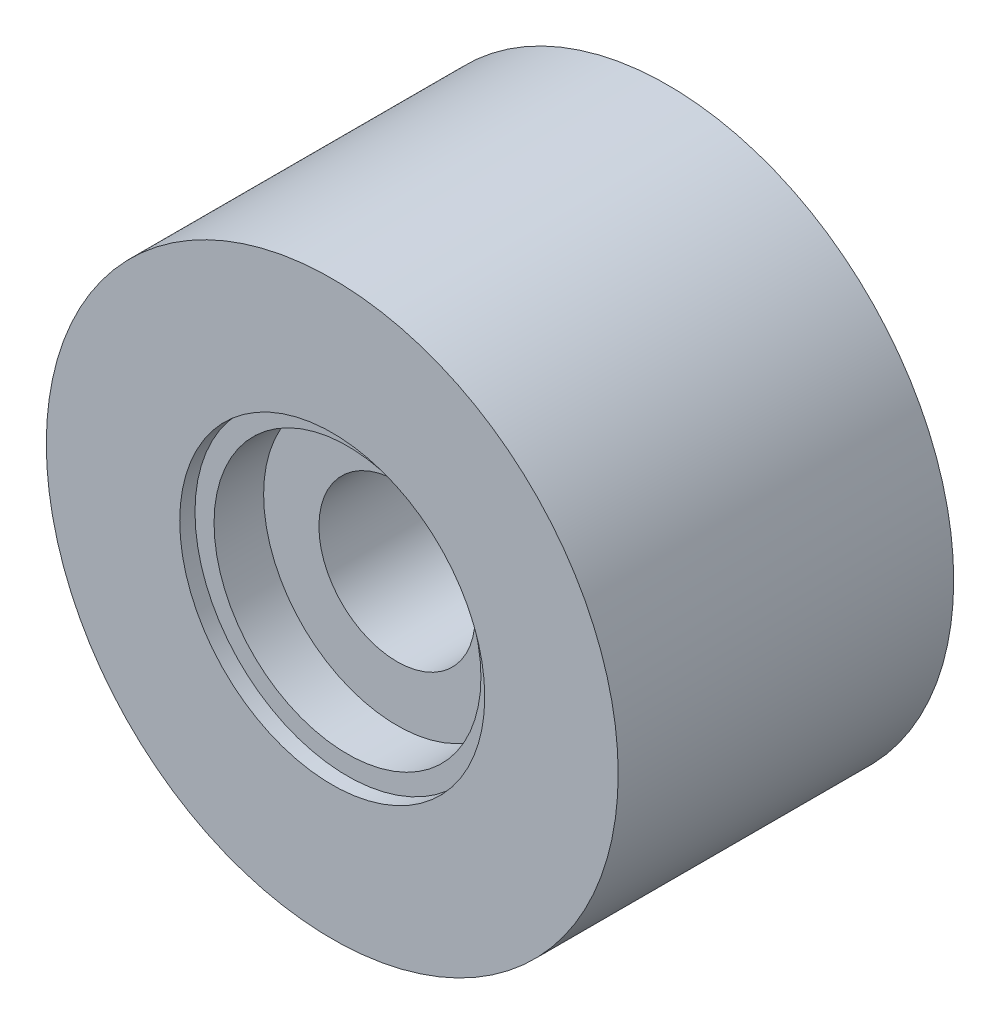
ISO-10303-21;
HEADER;
FILE_DESCRIPTION(('STEP AP214'),'2;1');
FILE_NAME('part.step','',(''),(''),'','','');
FILE_SCHEMA(('AUTOMOTIVE_DESIGN { 1 0 10303 214 1 1 1 1 }'));
ENDSEC;
DATA;
#1=APPLICATION_CONTEXT('core data for automotive mechanical design processes');
#2=APPLICATION_PROTOCOL_DEFINITION('international standard','automotive_design',2000,#1);
#3=PRODUCT_CONTEXT('',#1,'mechanical');
#4=PRODUCT('Part','Part','',(#3));
#5=PRODUCT_RELATED_PRODUCT_CATEGORY('part','',(#4));
#6=PRODUCT_DEFINITION_FORMATION('','',#4);
#7=PRODUCT_DEFINITION_CONTEXT('part definition',#1,'design');
#8=PRODUCT_DEFINITION('design','',#6,#7);
#9=PRODUCT_DEFINITION_SHAPE('','',#8);
#10=(LENGTH_UNIT() NAMED_UNIT(*) SI_UNIT(.MILLI.,.METRE.));
#11=(NAMED_UNIT(*) PLANE_ANGLE_UNIT() SI_UNIT($,.RADIAN.));
#12=(NAMED_UNIT(*) SI_UNIT($,.STERADIAN.) SOLID_ANGLE_UNIT());
#13=UNCERTAINTY_MEASURE_WITH_UNIT(LENGTH_MEASURE(1.E-05),#10,'distance_accuracy_value','');
#14=(GEOMETRIC_REPRESENTATION_CONTEXT(3) GLOBAL_UNCERTAINTY_ASSIGNED_CONTEXT((#13)) GLOBAL_UNIT_ASSIGNED_CONTEXT((#10,
#11,#12)) REPRESENTATION_CONTEXT('',''));
#15=CARTESIAN_POINT('',(0.,0.,0.));
#16=DIRECTION('',(0.,0.,1.));
#17=DIRECTION('',(1.,0.,0.));
#18=AXIS2_PLACEMENT_3D('',#15,#16,#17);
#19=CARTESIAN_POINT('',(0.,0.,16.));
#20=DIRECTION('',(0.,0.,1.));
#21=DIRECTION('',(1.,0.,0.));
#22=AXIS2_PLACEMENT_3D('',#19,#20,#21);
#23=PLANE('',#22);
#24=CARTESIAN_POINT('',(0.,0.,16.));
#25=DIRECTION('',(0.,0.,1.));
#26=DIRECTION('',(1.,0.,0.));
#27=AXIS2_PLACEMENT_3D('',#24,#25,#26);
#28=CIRCLE('',#27,7.);
#29=CARTESIAN_POINT('',(7.,0.,16.));
#30=VERTEX_POINT('',#29);
#31=EDGE_CURVE('E50',#30,#30,#28,.T.);
#32=ORIENTED_EDGE('',*,*,#31,.F.);
#33=EDGE_LOOP('',(#32));
#34=FACE_BOUND('',#33,.T.);
#35=CARTESIAN_POINT('',(0.,0.,16.));
#36=DIRECTION('',(0.,0.,1.));
#37=DIRECTION('',(1.,0.,0.));
#38=AXIS2_PLACEMENT_3D('',#35,#36,#37);
#39=CIRCLE('',#38,8.);
#40=CARTESIAN_POINT('',(8.,0.,16.));
#41=VERTEX_POINT('',#40);
#42=EDGE_CURVE('E78',#41,#41,#39,.T.);
#43=ORIENTED_EDGE('',*,*,#42,.T.);
#44=EDGE_LOOP('',(#43));
#45=FACE_BOUND('',#44,.T.);
#46=ADVANCED_FACE('F37',(#34,#45),#23,.T.);
#47=CARTESIAN_POINT('',(0.,0.,0.));
#48=DIRECTION('',(0.,0.,1.));
#49=DIRECTION('',(1.,0.,0.));
#50=AXIS2_PLACEMENT_3D('',#47,#48,#49);
#51=PLANE('',#50);
#52=CARTESIAN_POINT('',(0.,0.,0.));
#53=DIRECTION('',(0.,0.,1.));
#54=DIRECTION('',(1.,0.,0.));
#55=AXIS2_PLACEMENT_3D('',#52,#53,#54);
#56=CIRCLE('',#55,7.);
#57=CARTESIAN_POINT('',(7.,0.,0.));
#58=VERTEX_POINT('',#57);
#59=EDGE_CURVE('E10',#58,#58,#56,.T.);
#60=ORIENTED_EDGE('',*,*,#59,.T.);
#61=EDGE_LOOP('',(#60));
#62=FACE_BOUND('',#61,.T.);
#63=CARTESIAN_POINT('',(0.,0.,0.));
#64=DIRECTION('',(0.,0.,-1.));
#65=DIRECTION('',(-1.,0.,0.));
#66=AXIS2_PLACEMENT_3D('',#63,#64,#65);
#67=CIRCLE('',#66,8.);
#68=CARTESIAN_POINT('',(-8.,0.,0.));
#69=VERTEX_POINT('',#68);
#70=EDGE_CURVE('E66',#69,#69,#67,.T.);
#71=ORIENTED_EDGE('',*,*,#70,.T.);
#72=EDGE_LOOP('',(#71));
#73=FACE_BOUND('',#72,.T.);
#74=ADVANCED_FACE('F112',(#62,#73),#51,.F.);
#75=CARTESIAN_POINT('',(0.,0.,13.4));
#76=DIRECTION('',(0.,0.,1.));
#77=DIRECTION('',(1.,0.,0.));
#78=AXIS2_PLACEMENT_3D('',#75,#76,#77);
#79=PLANE('',#78);
#80=CARTESIAN_POINT('',(0.,0.,13.4));
#81=DIRECTION('',(0.,0.,1.));
#82=DIRECTION('',(1.,0.,0.));
#83=AXIS2_PLACEMENT_3D('',#80,#81,#82);
#84=CIRCLE('',#83,4.1);
#85=CARTESIAN_POINT('',(4.1,0.,13.4));
#86=VERTEX_POINT('',#85);
#87=EDGE_CURVE('E82',#86,#86,#84,.T.);
#88=ORIENTED_EDGE('',*,*,#87,.F.);
#89=EDGE_LOOP('',(#88));
#90=FACE_BOUND('',#89,.T.);
#91=CARTESIAN_POINT('',(0.,0.,13.4));
#92=DIRECTION('',(0.,0.,1.));
#93=DIRECTION('',(1.,0.,0.));
#94=AXIS2_PLACEMENT_3D('',#91,#92,#93);
#95=CIRCLE('',#94,7.);
#96=CARTESIAN_POINT('',(7.,0.,13.4));
#97=VERTEX_POINT('',#96);
#98=EDGE_CURVE('E55',#97,#97,#95,.T.);
#99=ORIENTED_EDGE('',*,*,#98,.T.);
#100=EDGE_LOOP('',(#99));
#101=FACE_BOUND('',#100,.T.);
#102=ADVANCED_FACE('F118',(#90,#101),#79,.T.);
#103=CARTESIAN_POINT('',(0.,0.,2.6));
#104=DIRECTION('',(0.,0.,-1.));
#105=DIRECTION('',(-1.,0.,0.));
#106=AXIS2_PLACEMENT_3D('',#103,#104,#105);
#107=CYLINDRICAL_SURFACE('',#106,15.);
#108=CARTESIAN_POINT('',(0.,0.,-0.8));
#109=DIRECTION('',(0.,0.,-1.));
#110=DIRECTION('',(-1.,0.,0.));
#111=AXIS2_PLACEMENT_3D('',#108,#109,#110);
#112=CIRCLE('',#111,15.);
#113=CARTESIAN_POINT('',(-15.,0.,-0.8));
#114=VERTEX_POINT('',#113);
#115=EDGE_CURVE('E60',#114,#114,#112,.T.);
#116=ORIENTED_EDGE('',*,*,#115,.F.);
#117=EDGE_LOOP('',(#116));
#118=FACE_BOUND('',#117,.T.);
#119=CARTESIAN_POINT('',(0.,0.,16.8));
#120=DIRECTION('',(0.,0.,1.));
#121=DIRECTION('',(1.,0.,0.));
#122=AXIS2_PLACEMENT_3D('',#119,#120,#121);
#123=CIRCLE('',#122,15.);
#124=CARTESIAN_POINT('',(15.,0.,16.8));
#125=VERTEX_POINT('',#124);
#126=EDGE_CURVE('E70',#125,#125,#123,.T.);
#127=ORIENTED_EDGE('',*,*,#126,.F.);
#128=EDGE_LOOP('',(#127));
#129=FACE_BOUND('',#128,.T.);
#130=ADVANCED_FACE('F39',(#118,#129),#107,.T.);
#131=CARTESIAN_POINT('',(0.,0.,2.6));
#132=DIRECTION('',(0.,0.,-1.));
#133=DIRECTION('',(-1.,0.,0.));
#134=AXIS2_PLACEMENT_3D('',#131,#132,#133);
#135=CYLINDRICAL_SURFACE('',#134,7.);
#136=CARTESIAN_POINT('',(0.,0.,2.6));
#137=DIRECTION('',(0.,0.,1.));
#138=DIRECTION('',(1.,0.,0.));
#139=AXIS2_PLACEMENT_3D('',#136,#137,#138);
#140=CIRCLE('',#139,7.);
#141=CARTESIAN_POINT('',(7.,0.,2.6));
#142=VERTEX_POINT('',#141);
#143=EDGE_CURVE('E45',#142,#142,#140,.T.);
#144=ORIENTED_EDGE('',*,*,#143,.T.);
#145=EDGE_LOOP('',(#144));
#146=FACE_BOUND('',#145,.T.);
#147=ORIENTED_EDGE('',*,*,#59,.F.);
#148=EDGE_LOOP('',(#147));
#149=FACE_BOUND('',#148,.T.);
#150=ADVANCED_FACE('F100',(#146,#149),#135,.F.);
#151=CARTESIAN_POINT('',(0.,0.,2.6));
#152=DIRECTION('',(0.,0.,1.));
#153=DIRECTION('',(1.,0.,0.));
#154=AXIS2_PLACEMENT_3D('',#151,#152,#153);
#155=PLANE('',#154);
#156=CARTESIAN_POINT('',(0.,0.,2.6));
#157=DIRECTION('',(0.,0.,-1.));
#158=DIRECTION('',(-1.,0.,0.));
#159=AXIS2_PLACEMENT_3D('',#156,#157,#158);
#160=CIRCLE('',#159,4.1);
#161=CARTESIAN_POINT('',(-4.1,0.,2.6));
#162=VERTEX_POINT('',#161);
#163=EDGE_CURVE('E89',#162,#162,#160,.T.);
#164=ORIENTED_EDGE('',*,*,#163,.F.);
#165=EDGE_LOOP('',(#164));
#166=FACE_BOUND('',#165,.T.);
#167=ORIENTED_EDGE('',*,*,#143,.F.);
#168=EDGE_LOOP('',(#167));
#169=FACE_BOUND('',#168,.T.);
#170=ADVANCED_FACE('F96',(#166,#169),#155,.F.);
#171=CARTESIAN_POINT('',(0.,0.,16.));
#172=DIRECTION('',(0.,0.,-1.));
#173=DIRECTION('',(-1.,0.,0.));
#174=AXIS2_PLACEMENT_3D('',#171,#172,#173);
#175=CYLINDRICAL_SURFACE('',#174,7.);
#176=ORIENTED_EDGE('',*,*,#31,.T.);
#177=EDGE_LOOP('',(#176));
#178=FACE_BOUND('',#177,.T.);
#179=ORIENTED_EDGE('',*,*,#98,.F.);
#180=EDGE_LOOP('',(#179));
#181=FACE_BOUND('',#180,.T.);
#182=ADVANCED_FACE('F99',(#178,#181),#175,.F.);
#183=CARTESIAN_POINT('',(0.,0.,-0.8));
#184=DIRECTION('',(0.,0.,-1.));
#185=DIRECTION('',(-1.,0.,0.));
#186=AXIS2_PLACEMENT_3D('',#183,#184,#185);
#187=PLANE('',#186);
#188=ORIENTED_EDGE('',*,*,#115,.T.);
#189=EDGE_LOOP('',(#188));
#190=FACE_BOUND('',#189,.T.);
#191=CARTESIAN_POINT('',(0.,0.,-0.8));
#192=DIRECTION('',(0.,0.,-1.));
#193=DIRECTION('',(-1.,0.,0.));
#194=AXIS2_PLACEMENT_3D('',#191,#192,#193);
#195=CIRCLE('',#194,8.);
#196=CARTESIAN_POINT('',(-8.,0.,-0.8));
#197=VERTEX_POINT('',#196);
#198=EDGE_CURVE('E65',#197,#197,#195,.T.);
#199=ORIENTED_EDGE('',*,*,#198,.F.);
#200=EDGE_LOOP('',(#199));
#201=FACE_BOUND('',#200,.T.);
#202=ADVANCED_FACE('F106',(#190,#201),#187,.T.);
#203=CARTESIAN_POINT('',(0.,0.,-0.8));
#204=DIRECTION('',(0.,0.,1.));
#205=DIRECTION('',(1.,0.,0.));
#206=AXIS2_PLACEMENT_3D('',#203,#204,#205);
#207=CYLINDRICAL_SURFACE('',#206,8.);
#208=ORIENTED_EDGE('',*,*,#198,.T.);
#209=EDGE_LOOP('',(#208));
#210=FACE_BOUND('',#209,.T.);
#211=ORIENTED_EDGE('',*,*,#70,.F.);
#212=EDGE_LOOP('',(#211));
#213=FACE_BOUND('',#212,.T.);
#214=ADVANCED_FACE('F145',(#210,#213),#207,.F.);
#215=CARTESIAN_POINT('',(0.,0.,16.8));
#216=DIRECTION('',(0.,0.,1.));
#217=DIRECTION('',(1.,0.,0.));
#218=AXIS2_PLACEMENT_3D('',#215,#216,#217);
#219=PLANE('',#218);
#220=ORIENTED_EDGE('',*,*,#126,.T.);
#221=EDGE_LOOP('',(#220));
#222=FACE_BOUND('',#221,.T.);
#223=CARTESIAN_POINT('',(0.,0.,16.8));
#224=DIRECTION('',(0.,0.,1.));
#225=DIRECTION('',(1.,0.,0.));
#226=AXIS2_PLACEMENT_3D('',#223,#224,#225);
#227=CIRCLE('',#226,8.);
#228=CARTESIAN_POINT('',(8.,0.,16.8));
#229=VERTEX_POINT('',#228);
#230=EDGE_CURVE('E77',#229,#229,#227,.T.);
#231=ORIENTED_EDGE('',*,*,#230,.F.);
#232=EDGE_LOOP('',(#231));
#233=FACE_BOUND('',#232,.T.);
#234=ADVANCED_FACE('F139',(#222,#233),#219,.T.);
#235=CARTESIAN_POINT('',(0.,0.,16.8));
#236=DIRECTION('',(0.,0.,-1.));
#237=DIRECTION('',(-1.,0.,0.));
#238=AXIS2_PLACEMENT_3D('',#235,#236,#237);
#239=CYLINDRICAL_SURFACE('',#238,8.);
#240=ORIENTED_EDGE('',*,*,#230,.T.);
#241=EDGE_LOOP('',(#240));
#242=FACE_BOUND('',#241,.T.);
#243=ORIENTED_EDGE('',*,*,#42,.F.);
#244=EDGE_LOOP('',(#243));
#245=FACE_BOUND('',#244,.T.);
#246=ADVANCED_FACE('F134',(#242,#245),#239,.F.);
#247=CARTESIAN_POINT('',(0.,0.,32.6));
#248=DIRECTION('',(0.,0.,-1.));
#249=DIRECTION('',(-1.,0.,0.));
#250=AXIS2_PLACEMENT_3D('',#247,#248,#249);
#251=CYLINDRICAL_SURFACE('',#250,4.1);
#252=ORIENTED_EDGE('',*,*,#87,.T.);
#253=EDGE_LOOP('',(#252));
#254=FACE_BOUND('',#253,.T.);
#255=ORIENTED_EDGE('',*,*,#163,.T.);
#256=EDGE_LOOP('',(#255));
#257=FACE_BOUND('',#256,.T.);
#258=ADVANCED_FACE('F94',(#254,#257),#251,.F.);
#259=CLOSED_SHELL('',(#46,#74,#102,#130,#150,#170,#182,#202,#214,#234,#246,#258));
#260=MANIFOLD_SOLID_BREP('B2',#259);
#261=ADVANCED_BREP_SHAPE_REPRESENTATION('',(#18,#260),#14);
#262=SHAPE_DEFINITION_REPRESENTATION(#9,#261);
ENDSEC;
END-ISO-10303-21;
